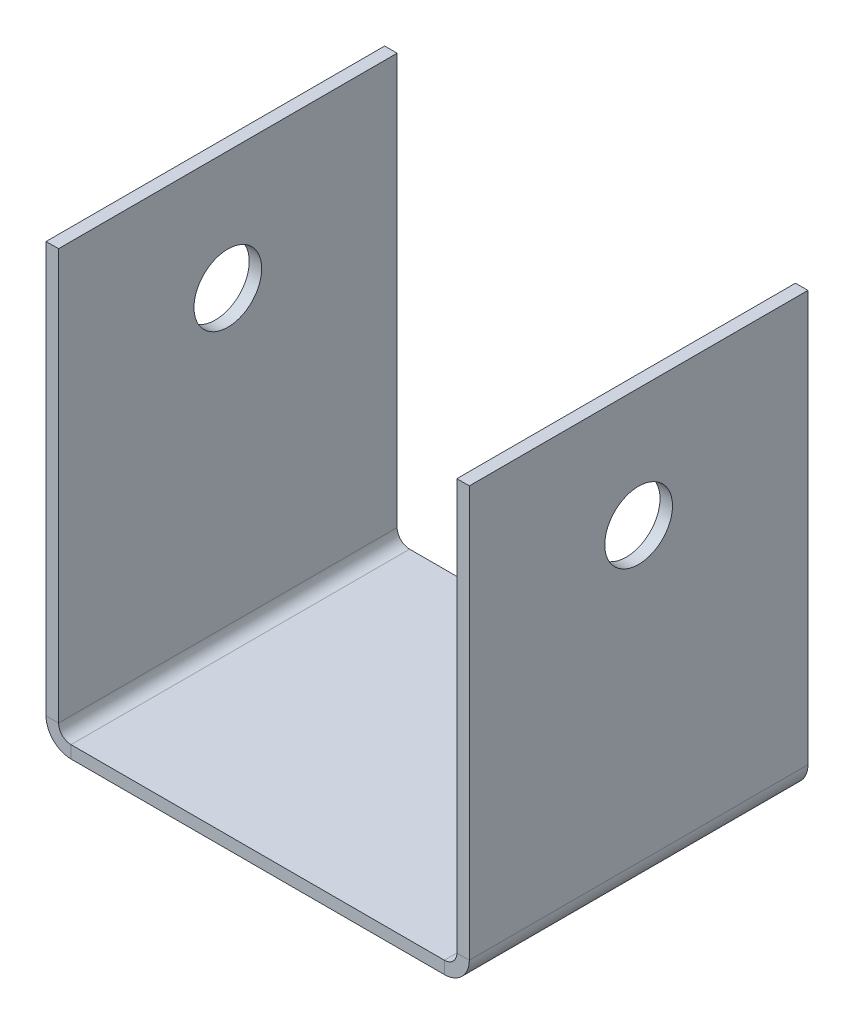
ISO-10303-21;
HEADER;
FILE_DESCRIPTION(('STEP AP214'),'2;1');
FILE_NAME('part.step','',(''),(''),'','','');
FILE_SCHEMA(('AUTOMOTIVE_DESIGN { 1 0 10303 214 1 1 1 1 }'));
ENDSEC;
DATA;
#1=APPLICATION_CONTEXT('core data for automotive mechanical design processes');
#2=APPLICATION_PROTOCOL_DEFINITION('international standard','automotive_design',2000,#1);
#3=PRODUCT_CONTEXT('',#1,'mechanical');
#4=PRODUCT('Part','Part','',(#3));
#5=PRODUCT_RELATED_PRODUCT_CATEGORY('part','',(#4));
#6=PRODUCT_DEFINITION_FORMATION('','',#4);
#7=PRODUCT_DEFINITION_CONTEXT('part definition',#1,'design');
#8=PRODUCT_DEFINITION('design','',#6,#7);
#9=PRODUCT_DEFINITION_SHAPE('','',#8);
#10=(LENGTH_UNIT() NAMED_UNIT(*) SI_UNIT(.MILLI.,.METRE.));
#11=(NAMED_UNIT(*) PLANE_ANGLE_UNIT() SI_UNIT($,.RADIAN.));
#12=(NAMED_UNIT(*) SI_UNIT($,.STERADIAN.) SOLID_ANGLE_UNIT());
#13=UNCERTAINTY_MEASURE_WITH_UNIT(LENGTH_MEASURE(1.E-05),#10,'distance_accuracy_value','');
#14=(GEOMETRIC_REPRESENTATION_CONTEXT(3) GLOBAL_UNCERTAINTY_ASSIGNED_CONTEXT((#13)) GLOBAL_UNIT_ASSIGNED_CONTEXT((#10,
#11,#12)) REPRESENTATION_CONTEXT('',''));
#15=CARTESIAN_POINT('',(0.,0.,0.));
#16=DIRECTION('',(0.,0.,1.));
#17=DIRECTION('',(1.,0.,0.));
#18=AXIS2_PLACEMENT_3D('',#15,#16,#17);
#19=CARTESIAN_POINT('',(0.,-0.7366,0.));
#20=DIRECTION('',(0.,-1.,0.));
#21=DIRECTION('',(0.,0.,-1.));
#22=AXIS2_PLACEMENT_3D('',#19,#20,#21);
#23=PLANE('',#22);
#24=DIRECTION('',(1.,0.,0.));
#25=VECTOR('',#24,1.);
#26=CARTESIAN_POINT('',(-12.5,-0.7366,10.));
#27=LINE('',#26,#25);
#28=CARTESIAN_POINT('',(-11.0268,-0.736600000000001,10.));
#29=VERTEX_POINT('',#28);
#30=CARTESIAN_POINT('',(11.0268,-0.7366,10.));
#31=VERTEX_POINT('',#30);
#32=EDGE_CURVE('E13',#29,#31,#27,.T.);
#33=ORIENTED_EDGE('',*,*,#32,.F.);
#34=DIRECTION('',(0.,0.,1.));
#35=VECTOR('',#34,1.);
#36=CARTESIAN_POINT('',(-11.0268,-0.736600000000001,10.));
#37=LINE('',#36,#35);
#38=CARTESIAN_POINT('',(-11.0268,-0.7366,-10.));
#39=VERTEX_POINT('',#38);
#40=EDGE_CURVE('E208',#29,#39,#37,.F.);
#41=ORIENTED_EDGE('',*,*,#40,.T.);
#42=DIRECTION('',(-1.,0.,0.));
#43=VECTOR('',#42,1.);
#44=CARTESIAN_POINT('',(-12.5,-0.7366,-10.));
#45=LINE('',#44,#43);
#46=CARTESIAN_POINT('',(11.0268,-0.736600000000001,-10.));
#47=VERTEX_POINT('',#46);
#48=EDGE_CURVE('E84',#47,#39,#45,.T.);
#49=ORIENTED_EDGE('',*,*,#48,.F.);
#50=DIRECTION('',(0.,0.,-1.));
#51=VECTOR('',#50,1.);
#52=CARTESIAN_POINT('',(11.0268,-0.736600000000001,-10.));
#53=LINE('',#52,#51);
#54=EDGE_CURVE('E259',#47,#31,#53,.F.);
#55=ORIENTED_EDGE('',*,*,#54,.T.);
#56=EDGE_LOOP('',(#33,#41,#49,#55));
#57=FACE_BOUND('',#56,.T.);
#58=ADVANCED_FACE('F75',(#57),#23,.T.);
#59=CARTESIAN_POINT('',(0.,0.,0.));
#60=DIRECTION('',(0.,-1.,0.));
#61=DIRECTION('',(0.,0.,-1.));
#62=AXIS2_PLACEMENT_3D('',#59,#60,#61);
#63=PLANE('',#62);
#64=DIRECTION('',(0.,0.,1.));
#65=VECTOR('',#64,1.);
#66=CARTESIAN_POINT('',(-11.0268,0.,10.));
#67=LINE('',#66,#65);
#68=CARTESIAN_POINT('',(-11.0268,0.,10.));
#69=VERTEX_POINT('',#68);
#70=CARTESIAN_POINT('',(-11.0268,0.,-10.));
#71=VERTEX_POINT('',#70);
#72=EDGE_CURVE('E219',#69,#71,#67,.F.);
#73=ORIENTED_EDGE('',*,*,#72,.F.);
#74=DIRECTION('',(1.,0.,0.));
#75=VECTOR('',#74,1.);
#76=CARTESIAN_POINT('',(-12.5,0.,10.));
#77=LINE('',#76,#75);
#78=CARTESIAN_POINT('',(11.0268,0.,10.));
#79=VERTEX_POINT('',#78);
#80=EDGE_CURVE('E79',#69,#79,#77,.T.);
#81=ORIENTED_EDGE('',*,*,#80,.T.);
#82=DIRECTION('',(0.,0.,-1.));
#83=VECTOR('',#82,1.);
#84=CARTESIAN_POINT('',(11.0268,0.,-10.));
#85=LINE('',#84,#83);
#86=CARTESIAN_POINT('',(11.0268,0.,-10.));
#87=VERTEX_POINT('',#86);
#88=EDGE_CURVE('E270',#87,#79,#85,.F.);
#89=ORIENTED_EDGE('',*,*,#88,.F.);
#90=DIRECTION('',(-1.,0.,0.));
#91=VECTOR('',#90,1.);
#92=CARTESIAN_POINT('',(-12.5,0.,-10.));
#93=LINE('',#92,#91);
#94=EDGE_CURVE('E276',#87,#71,#93,.T.);
#95=ORIENTED_EDGE('',*,*,#94,.T.);
#96=EDGE_LOOP('',(#73,#81,#89,#95));
#97=FACE_BOUND('',#96,.T.);
#98=ADVANCED_FACE('F288',(#97),#63,.F.);
#99=CARTESIAN_POINT('',(-12.5,-0.7366,10.));
#100=DIRECTION('',(0.,0.,1.));
#101=DIRECTION('',(1.,0.,0.));
#102=AXIS2_PLACEMENT_3D('',#99,#100,#101);
#103=PLANE('',#102);
#104=ORIENTED_EDGE('',*,*,#80,.F.);
#105=DIRECTION('',(0.,-1.,0.));
#106=VECTOR('',#105,1.);
#107=CARTESIAN_POINT('',(-11.0268,0.,10.));
#108=LINE('',#107,#106);
#109=EDGE_CURVE('E213',#69,#29,#108,.T.);
#110=ORIENTED_EDGE('',*,*,#109,.T.);
#111=ORIENTED_EDGE('',*,*,#32,.T.);
#112=DIRECTION('',(0.,-1.,0.));
#113=VECTOR('',#112,1.);
#114=CARTESIAN_POINT('',(11.0268,0.,10.));
#115=LINE('',#114,#113);
#116=EDGE_CURVE('E274',#79,#31,#115,.T.);
#117=ORIENTED_EDGE('',*,*,#116,.F.);
#118=EDGE_LOOP('',(#104,#110,#111,#117));
#119=FACE_BOUND('',#118,.T.);
#120=ADVANCED_FACE('F290',(#119),#103,.T.);
#121=CARTESIAN_POINT('',(-12.5,-0.7366,-10.));
#122=DIRECTION('',(0.,0.,-1.));
#123=DIRECTION('',(-1.,0.,0.));
#124=AXIS2_PLACEMENT_3D('',#121,#122,#123);
#125=PLANE('',#124);
#126=DIRECTION('',(0.,-1.,0.));
#127=VECTOR('',#126,1.);
#128=CARTESIAN_POINT('',(-11.0268,0.,-10.));
#129=LINE('',#128,#127);
#130=EDGE_CURVE('E224',#71,#39,#129,.T.);
#131=ORIENTED_EDGE('',*,*,#130,.F.);
#132=ORIENTED_EDGE('',*,*,#94,.F.);
#133=DIRECTION('',(0.,-1.,0.));
#134=VECTOR('',#133,1.);
#135=CARTESIAN_POINT('',(11.0268,0.,-10.));
#136=LINE('',#135,#134);
#137=EDGE_CURVE('E264',#87,#47,#136,.T.);
#138=ORIENTED_EDGE('',*,*,#137,.T.);
#139=ORIENTED_EDGE('',*,*,#48,.T.);
#140=EDGE_LOOP('',(#131,#132,#138,#139));
#141=FACE_BOUND('',#140,.T.);
#142=ADVANCED_FACE('F77',(#141),#125,.T.);
#143=CARTESIAN_POINT('',(11.0268,0.7366,10.));
#144=DIRECTION('',(0.,0.,1.));
#145=DIRECTION('',(1.,0.,0.));
#146=AXIS2_PLACEMENT_3D('',#143,#144,#145);
#147=PLANE('',#146);
#148=DIRECTION('',(-1.,0.,0.));
#149=VECTOR('',#148,1.);
#150=CARTESIAN_POINT('',(12.5,0.736599999999994,10.));
#151=LINE('',#150,#149);
#152=CARTESIAN_POINT('',(11.7634,0.736599999999997,10.));
#153=VERTEX_POINT('',#152);
#154=CARTESIAN_POINT('',(12.5,0.736599999999994,10.));
#155=VERTEX_POINT('',#154);
#156=EDGE_CURVE('E226',#153,#155,#151,.F.);
#157=ORIENTED_EDGE('',*,*,#156,.F.);
#158=CARTESIAN_POINT('',(11.0268,0.7366,10.));
#159=DIRECTION('',(0.,0.,-1.));
#160=DIRECTION('',(-1.,0.,0.));
#161=AXIS2_PLACEMENT_3D('',#158,#159,#160);
#162=CIRCLE('',#161,0.7366);
#163=EDGE_CURVE('E267',#79,#153,#162,.F.);
#164=ORIENTED_EDGE('',*,*,#163,.F.);
#165=ORIENTED_EDGE('',*,*,#116,.T.);
#166=CARTESIAN_POINT('',(11.0268,0.7366,10.));
#167=DIRECTION('',(0.,0.,-1.));
#168=DIRECTION('',(-1.,0.,0.));
#169=AXIS2_PLACEMENT_3D('',#166,#167,#168);
#170=CIRCLE('',#169,1.4732);
#171=EDGE_CURVE('E92',#31,#155,#170,.F.);
#172=ORIENTED_EDGE('',*,*,#171,.T.);
#173=EDGE_LOOP('',(#157,#164,#165,#172));
#174=FACE_BOUND('',#173,.T.);
#175=ADVANCED_FACE('F294',(#174),#147,.T.);
#176=CARTESIAN_POINT('',(11.0268,0.7366,-10.));
#177=DIRECTION('',(0.,0.,1.));
#178=DIRECTION('',(1.,0.,0.));
#179=AXIS2_PLACEMENT_3D('',#176,#177,#178);
#180=PLANE('',#179);
#181=CARTESIAN_POINT('',(11.0268,0.7366,-10.));
#182=DIRECTION('',(0.,0.,-1.));
#183=DIRECTION('',(-1.,0.,0.));
#184=AXIS2_PLACEMENT_3D('',#181,#182,#183);
#185=CIRCLE('',#184,0.7366);
#186=CARTESIAN_POINT('',(11.7634,0.736599999999997,-10.));
#187=VERTEX_POINT('',#186);
#188=EDGE_CURVE('E232',#187,#87,#185,.T.);
#189=ORIENTED_EDGE('',*,*,#188,.F.);
#190=DIRECTION('',(-1.,0.,0.));
#191=VECTOR('',#190,1.);
#192=CARTESIAN_POINT('',(11.7634,0.736599999999997,-10.));
#193=LINE('',#192,#191);
#194=CARTESIAN_POINT('',(12.5,0.736599999999994,-10.));
#195=VERTEX_POINT('',#194);
#196=EDGE_CURVE('E252',#187,#195,#193,.F.);
#197=ORIENTED_EDGE('',*,*,#196,.T.);
#198=CARTESIAN_POINT('',(11.0268,0.7366,-10.));
#199=DIRECTION('',(0.,0.,-1.));
#200=DIRECTION('',(-1.,0.,0.));
#201=AXIS2_PLACEMENT_3D('',#198,#199,#200);
#202=CIRCLE('',#201,1.4732);
#203=EDGE_CURVE('E262',#195,#47,#202,.T.);
#204=ORIENTED_EDGE('',*,*,#203,.T.);
#205=ORIENTED_EDGE('',*,*,#137,.F.);
#206=EDGE_LOOP('',(#189,#197,#204,#205));
#207=FACE_BOUND('',#206,.T.);
#208=ADVANCED_FACE('F318',(#207),#180,.F.);
#209=CARTESIAN_POINT('',(11.0268,0.7366,-10.));
#210=DIRECTION('',(0.,0.,-1.));
#211=DIRECTION('',(1.,0.,0.));
#212=AXIS2_PLACEMENT_3D('',#209,#210,#211);
#213=CYLINDRICAL_SURFACE('',#212,1.4732);
#214=ORIENTED_EDGE('',*,*,#54,.F.);
#215=ORIENTED_EDGE('',*,*,#203,.F.);
#216=DIRECTION('',(0.,0.,-1.));
#217=VECTOR('',#216,1.);
#218=CARTESIAN_POINT('',(12.5,0.736599999999994,10.));
#219=LINE('',#218,#217);
#220=EDGE_CURVE('E250',#195,#155,#219,.F.);
#221=ORIENTED_EDGE('',*,*,#220,.T.);
#222=ORIENTED_EDGE('',*,*,#171,.F.);
#223=EDGE_LOOP('',(#214,#215,#221,#222));
#224=FACE_BOUND('',#223,.T.);
#225=ADVANCED_FACE('F321',(#224),#213,.T.);
#226=CARTESIAN_POINT('',(11.0268,0.7366,-10.));
#227=DIRECTION('',(0.,0.,-1.));
#228=DIRECTION('',(1.,0.,0.));
#229=AXIS2_PLACEMENT_3D('',#226,#227,#228);
#230=CYLINDRICAL_SURFACE('',#229,0.7366);
#231=ORIENTED_EDGE('',*,*,#88,.T.);
#232=ORIENTED_EDGE('',*,*,#163,.T.);
#233=DIRECTION('',(0.,0.,-1.));
#234=VECTOR('',#233,1.);
#235=CARTESIAN_POINT('',(11.7634,0.736599999999997,10.));
#236=LINE('',#235,#234);
#237=EDGE_CURVE('E255',#153,#187,#236,.T.);
#238=ORIENTED_EDGE('',*,*,#237,.T.);
#239=ORIENTED_EDGE('',*,*,#188,.T.);
#240=EDGE_LOOP('',(#231,#232,#238,#239));
#241=FACE_BOUND('',#240,.T.);
#242=ADVANCED_FACE('F297',(#241),#230,.F.);
#243=CARTESIAN_POINT('',(12.5,0.,10.));
#244=DIRECTION('',(0.,0.,-1.));
#245=DIRECTION('',(0.,1.,0.));
#246=AXIS2_PLACEMENT_3D('',#243,#244,#245);
#247=PLANE('',#246);
#248=ORIENTED_EDGE('',*,*,#156,.T.);
#249=DIRECTION('',(0.,-1.,0.));
#250=VECTOR('',#249,1.);
#251=CARTESIAN_POINT('',(12.5,0.,10.));
#252=LINE('',#251,#250);
#253=CARTESIAN_POINT('',(12.5000000000001,25.,10.));
#254=VERTEX_POINT('',#253);
#255=EDGE_CURVE('E240',#254,#155,#252,.T.);
#256=ORIENTED_EDGE('',*,*,#255,.F.);
#257=DIRECTION('',(-1.,0.,0.));
#258=VECTOR('',#257,1.);
#259=CARTESIAN_POINT('',(12.5000000000001,25.,10.));
#260=LINE('',#259,#258);
#261=CARTESIAN_POINT('',(11.7634000000001,25.,10.));
#262=VERTEX_POINT('',#261);
#263=EDGE_CURVE('E233',#254,#262,#260,.T.);
#264=ORIENTED_EDGE('',*,*,#263,.T.);
#265=DIRECTION('',(0.,1.,0.));
#266=VECTOR('',#265,1.);
#267=CARTESIAN_POINT('',(11.7634,0.,10.));
#268=LINE('',#267,#266);
#269=EDGE_CURVE('E247',#262,#153,#268,.F.);
#270=ORIENTED_EDGE('',*,*,#269,.T.);
#271=EDGE_LOOP('',(#248,#256,#264,#270));
#272=FACE_BOUND('',#271,.T.);
#273=ADVANCED_FACE('F305',(#272),#247,.F.);
#274=CARTESIAN_POINT('',(12.5000000000001,25.,-9.99999999999999));
#275=DIRECTION('',(0.,0.,1.));
#276=DIRECTION('',(0.,-1.,0.));
#277=AXIS2_PLACEMENT_3D('',#274,#275,#276);
#278=PLANE('',#277);
#279=ORIENTED_EDGE('',*,*,#196,.F.);
#280=DIRECTION('',(0.,-1.,0.));
#281=VECTOR('',#280,1.);
#282=CARTESIAN_POINT('',(11.7634000000001,25.,-9.99999999999999));
#283=LINE('',#282,#281);
#284=CARTESIAN_POINT('',(11.7634000000001,25.,-9.99999999999999));
#285=VERTEX_POINT('',#284);
#286=EDGE_CURVE('E245',#187,#285,#283,.F.);
#287=ORIENTED_EDGE('',*,*,#286,.T.);
#288=DIRECTION('',(-1.,0.,0.));
#289=VECTOR('',#288,1.);
#290=CARTESIAN_POINT('',(12.5000000000001,25.,-9.99999999999999));
#291=LINE('',#290,#289);
#292=CARTESIAN_POINT('',(12.5000000000001,25.,-9.99999999999999));
#293=VERTEX_POINT('',#292);
#294=EDGE_CURVE('E229',#293,#285,#291,.T.);
#295=ORIENTED_EDGE('',*,*,#294,.F.);
#296=DIRECTION('',(0.,1.,0.));
#297=VECTOR('',#296,1.);
#298=CARTESIAN_POINT('',(12.5,0.,-10.));
#299=LINE('',#298,#297);
#300=EDGE_CURVE('E238',#195,#293,#299,.T.);
#301=ORIENTED_EDGE('',*,*,#300,.F.);
#302=EDGE_LOOP('',(#279,#287,#295,#301));
#303=FACE_BOUND('',#302,.T.);
#304=ADVANCED_FACE('F315',(#303),#278,.F.);
#305=CARTESIAN_POINT('',(12.5,0.,0.));
#306=DIRECTION('',(-1.,0.,0.));
#307=DIRECTION('',(0.,-1.,0.));
#308=AXIS2_PLACEMENT_3D('',#305,#306,#307);
#309=PLANE('',#308);
#310=CARTESIAN_POINT('',(12.5000000000001,17.9834,0.));
#311=DIRECTION('',(1.,0.,0.));
#312=DIRECTION('',(0.,0.,-1.));
#313=AXIS2_PLACEMENT_3D('',#310,#311,#312);
#314=CIRCLE('',#313,1.99999999999999);
#315=CARTESIAN_POINT('',(12.5000000000001,17.9834,-1.99999999999999));
#316=VERTEX_POINT('',#315);
#317=EDGE_CURVE('E349',#316,#316,#314,.T.);
#318=ORIENTED_EDGE('',*,*,#317,.F.);
#319=EDGE_LOOP('',(#318));
#320=FACE_BOUND('',#319,.T.);
#321=ORIENTED_EDGE('',*,*,#220,.F.);
#322=ORIENTED_EDGE('',*,*,#300,.T.);
#323=DIRECTION('',(0.,0.,1.));
#324=VECTOR('',#323,1.);
#325=CARTESIAN_POINT('',(12.5000000000001,25.,0.));
#326=LINE('',#325,#324);
#327=EDGE_CURVE('E236',#293,#254,#326,.T.);
#328=ORIENTED_EDGE('',*,*,#327,.T.);
#329=ORIENTED_EDGE('',*,*,#255,.T.);
#330=EDGE_LOOP('',(#321,#322,#328,#329));
#331=FACE_BOUND('',#330,.T.);
#332=ADVANCED_FACE('F320',(#320,#331),#309,.F.);
#333=CARTESIAN_POINT('',(11.7634,0.,0.));
#334=DIRECTION('',(-1.,0.,0.));
#335=DIRECTION('',(0.,-1.,0.));
#336=AXIS2_PLACEMENT_3D('',#333,#334,#335);
#337=PLANE('',#336);
#338=CARTESIAN_POINT('',(11.7634000000001,17.9834,0.));
#339=DIRECTION('',(-1.,0.,0.));
#340=DIRECTION('',(0.,-1.,0.));
#341=AXIS2_PLACEMENT_3D('',#338,#339,#340);
#342=CIRCLE('',#341,1.99999999999999);
#343=CARTESIAN_POINT('',(11.7634000000001,15.9834,0.));
#344=VERTEX_POINT('',#343);
#345=EDGE_CURVE('E207',#344,#344,#342,.T.);
#346=ORIENTED_EDGE('',*,*,#345,.F.);
#347=EDGE_LOOP('',(#346));
#348=FACE_BOUND('',#347,.T.);
#349=ORIENTED_EDGE('',*,*,#286,.F.);
#350=ORIENTED_EDGE('',*,*,#237,.F.);
#351=ORIENTED_EDGE('',*,*,#269,.F.);
#352=DIRECTION('',(0.,0.,-1.));
#353=VECTOR('',#352,1.);
#354=CARTESIAN_POINT('',(11.7634000000001,25.,10.));
#355=LINE('',#354,#353);
#356=EDGE_CURVE('E243',#285,#262,#355,.F.);
#357=ORIENTED_EDGE('',*,*,#356,.F.);
#358=EDGE_LOOP('',(#349,#350,#351,#357));
#359=FACE_BOUND('',#358,.T.);
#360=ADVANCED_FACE('F302',(#348,#359),#337,.T.);
#361=CARTESIAN_POINT('',(12.5000000000001,25.,10.));
#362=DIRECTION('',(0.,-1.,0.));
#363=DIRECTION('',(1.,0.,0.));
#364=AXIS2_PLACEMENT_3D('',#361,#362,#363);
#365=PLANE('',#364);
#366=ORIENTED_EDGE('',*,*,#356,.T.);
#367=ORIENTED_EDGE('',*,*,#263,.F.);
#368=ORIENTED_EDGE('',*,*,#327,.F.);
#369=ORIENTED_EDGE('',*,*,#294,.T.);
#370=EDGE_LOOP('',(#366,#367,#368,#369));
#371=FACE_BOUND('',#370,.T.);
#372=ADVANCED_FACE('F310',(#371),#365,.F.);
#373=CARTESIAN_POINT('',(-11.0268,0.7366,-10.));
#374=DIRECTION('',(0.,0.,-1.));
#375=DIRECTION('',(-1.,0.,0.));
#376=AXIS2_PLACEMENT_3D('',#373,#374,#375);
#377=PLANE('',#376);
#378=DIRECTION('',(1.,0.,0.));
#379=VECTOR('',#378,1.);
#380=CARTESIAN_POINT('',(-12.5,0.736599999999994,-10.));
#381=LINE('',#380,#379);
#382=CARTESIAN_POINT('',(-11.7634,0.736599999999997,-10.));
#383=VERTEX_POINT('',#382);
#384=CARTESIAN_POINT('',(-12.5,0.736599999999994,-10.));
#385=VERTEX_POINT('',#384);
#386=EDGE_CURVE('E190',#383,#385,#381,.F.);
#387=ORIENTED_EDGE('',*,*,#386,.F.);
#388=CARTESIAN_POINT('',(-11.0268,0.7366,-10.));
#389=DIRECTION('',(0.,0.,1.));
#390=DIRECTION('',(1.,0.,0.));
#391=AXIS2_PLACEMENT_3D('',#388,#389,#390);
#392=CIRCLE('',#391,0.7366);
#393=EDGE_CURVE('E216',#71,#383,#392,.F.);
#394=ORIENTED_EDGE('',*,*,#393,.F.);
#395=ORIENTED_EDGE('',*,*,#130,.T.);
#396=CARTESIAN_POINT('',(-11.0268,0.7366,-10.));
#397=DIRECTION('',(0.,0.,1.));
#398=DIRECTION('',(1.,0.,0.));
#399=AXIS2_PLACEMENT_3D('',#396,#397,#398);
#400=CIRCLE('',#399,1.4732);
#401=EDGE_CURVE('E100',#39,#385,#400,.F.);
#402=ORIENTED_EDGE('',*,*,#401,.T.);
#403=EDGE_LOOP('',(#387,#394,#395,#402));
#404=FACE_BOUND('',#403,.T.);
#405=ADVANCED_FACE('F328',(#404),#377,.T.);
#406=CARTESIAN_POINT('',(-11.0268,0.7366,10.));
#407=DIRECTION('',(0.,0.,-1.));
#408=DIRECTION('',(-1.,0.,0.));
#409=AXIS2_PLACEMENT_3D('',#406,#407,#408);
#410=PLANE('',#409);
#411=CARTESIAN_POINT('',(-11.0268,0.7366,10.));
#412=DIRECTION('',(0.,0.,1.));
#413=DIRECTION('',(1.,0.,0.));
#414=AXIS2_PLACEMENT_3D('',#411,#412,#413);
#415=CIRCLE('',#414,0.7366);
#416=CARTESIAN_POINT('',(-11.7634,0.736599999999997,10.));
#417=VERTEX_POINT('',#416);
#418=EDGE_CURVE('E221',#417,#69,#415,.T.);
#419=ORIENTED_EDGE('',*,*,#418,.F.);
#420=DIRECTION('',(1.,0.,0.));
#421=VECTOR('',#420,1.);
#422=CARTESIAN_POINT('',(-11.7634,0.736599999999997,10.));
#423=LINE('',#422,#421);
#424=CARTESIAN_POINT('',(-12.5,0.736599999999994,10.));
#425=VERTEX_POINT('',#424);
#426=EDGE_CURVE('E201',#417,#425,#423,.F.);
#427=ORIENTED_EDGE('',*,*,#426,.T.);
#428=CARTESIAN_POINT('',(-11.0268,0.7366,10.));
#429=DIRECTION('',(0.,0.,1.));
#430=DIRECTION('',(1.,0.,0.));
#431=AXIS2_PLACEMENT_3D('',#428,#429,#430);
#432=CIRCLE('',#431,1.4732);
#433=EDGE_CURVE('E211',#425,#29,#432,.T.);
#434=ORIENTED_EDGE('',*,*,#433,.T.);
#435=ORIENTED_EDGE('',*,*,#109,.F.);
#436=EDGE_LOOP('',(#419,#427,#434,#435));
#437=FACE_BOUND('',#436,.T.);
#438=ADVANCED_FACE('F394',(#437),#410,.F.);
#439=CARTESIAN_POINT('',(-11.0268,0.7366,10.));
#440=DIRECTION('',(0.,0.,1.));
#441=DIRECTION('',(-1.,0.,0.));
#442=AXIS2_PLACEMENT_3D('',#439,#440,#441);
#443=CYLINDRICAL_SURFACE('',#442,1.4732);
#444=ORIENTED_EDGE('',*,*,#40,.F.);
#445=ORIENTED_EDGE('',*,*,#433,.F.);
#446=DIRECTION('',(0.,0.,1.));
#447=VECTOR('',#446,1.);
#448=CARTESIAN_POINT('',(-12.5,0.736599999999994,-10.));
#449=LINE('',#448,#447);
#450=EDGE_CURVE('E199',#425,#385,#449,.F.);
#451=ORIENTED_EDGE('',*,*,#450,.T.);
#452=ORIENTED_EDGE('',*,*,#401,.F.);
#453=EDGE_LOOP('',(#444,#445,#451,#452));
#454=FACE_BOUND('',#453,.T.);
#455=ADVANCED_FACE('F399',(#454),#443,.T.);
#456=CARTESIAN_POINT('',(-11.0268,0.7366,10.));
#457=DIRECTION('',(0.,0.,1.));
#458=DIRECTION('',(-1.,0.,0.));
#459=AXIS2_PLACEMENT_3D('',#456,#457,#458);
#460=CYLINDRICAL_SURFACE('',#459,0.7366);
#461=ORIENTED_EDGE('',*,*,#72,.T.);
#462=ORIENTED_EDGE('',*,*,#393,.T.);
#463=DIRECTION('',(0.,0.,1.));
#464=VECTOR('',#463,1.);
#465=CARTESIAN_POINT('',(-11.7634,0.736599999999997,-10.));
#466=LINE('',#465,#464);
#467=EDGE_CURVE('E204',#383,#417,#466,.T.);
#468=ORIENTED_EDGE('',*,*,#467,.T.);
#469=ORIENTED_EDGE('',*,*,#418,.T.);
#470=EDGE_LOOP('',(#461,#462,#468,#469));
#471=FACE_BOUND('',#470,.T.);
#472=ADVANCED_FACE('F331',(#471),#460,.F.);
#473=CARTESIAN_POINT('',(-12.5,0.,-10.));
#474=DIRECTION('',(0.,0.,1.));
#475=DIRECTION('',(0.,-1.,0.));
#476=AXIS2_PLACEMENT_3D('',#473,#474,#475);
#477=PLANE('',#476);
#478=ORIENTED_EDGE('',*,*,#386,.T.);
#479=DIRECTION('',(0.,-1.,0.));
#480=VECTOR('',#479,1.);
#481=CARTESIAN_POINT('',(-12.5,0.,-10.));
#482=LINE('',#481,#480);
#483=CARTESIAN_POINT('',(-12.5000000000001,25.,-10.));
#484=VERTEX_POINT('',#483);
#485=EDGE_CURVE('E171',#484,#385,#482,.T.);
#486=ORIENTED_EDGE('',*,*,#485,.F.);
#487=DIRECTION('',(1.,0.,0.));
#488=VECTOR('',#487,1.);
#489=CARTESIAN_POINT('',(-12.5000000000001,25.,-10.));
#490=LINE('',#489,#488);
#491=CARTESIAN_POINT('',(-11.7634000000001,25.,-10.));
#492=VERTEX_POINT('',#491);
#493=EDGE_CURVE('E177',#484,#492,#490,.T.);
#494=ORIENTED_EDGE('',*,*,#493,.T.);
#495=DIRECTION('',(0.,1.,0.));
#496=VECTOR('',#495,1.);
#497=CARTESIAN_POINT('',(-11.7634,0.,-10.));
#498=LINE('',#497,#496);
#499=EDGE_CURVE('E197',#492,#383,#498,.F.);
#500=ORIENTED_EDGE('',*,*,#499,.T.);
#501=EDGE_LOOP('',(#478,#486,#494,#500));
#502=FACE_BOUND('',#501,.T.);
#503=ADVANCED_FACE('F189',(#502),#477,.F.);
#504=CARTESIAN_POINT('',(-12.5000000000001,25.,9.99999999999999));
#505=DIRECTION('',(0.,0.,-1.));
#506=DIRECTION('',(0.,1.,0.));
#507=AXIS2_PLACEMENT_3D('',#504,#505,#506);
#508=PLANE('',#507);
#509=ORIENTED_EDGE('',*,*,#426,.F.);
#510=DIRECTION('',(0.,-1.,0.));
#511=VECTOR('',#510,1.);
#512=CARTESIAN_POINT('',(-11.7634000000001,25.,9.99999999999999));
#513=LINE('',#512,#511);
#514=CARTESIAN_POINT('',(-11.7634000000001,25.,9.99999999999999));
#515=VERTEX_POINT('',#514);
#516=EDGE_CURVE('E193',#417,#515,#513,.F.);
#517=ORIENTED_EDGE('',*,*,#516,.T.);
#518=DIRECTION('',(1.,0.,0.));
#519=VECTOR('',#518,1.);
#520=CARTESIAN_POINT('',(-12.5000000000001,25.,9.99999999999999));
#521=LINE('',#520,#519);
#522=CARTESIAN_POINT('',(-12.5000000000001,25.,9.99999999999999));
#523=VERTEX_POINT('',#522);
#524=EDGE_CURVE('E186',#523,#515,#521,.T.);
#525=ORIENTED_EDGE('',*,*,#524,.F.);
#526=DIRECTION('',(0.,1.,0.));
#527=VECTOR('',#526,1.);
#528=CARTESIAN_POINT('',(-12.5,0.,10.));
#529=LINE('',#528,#527);
#530=EDGE_CURVE('E173',#425,#523,#529,.T.);
#531=ORIENTED_EDGE('',*,*,#530,.F.);
#532=EDGE_LOOP('',(#509,#517,#525,#531));
#533=FACE_BOUND('',#532,.T.);
#534=ADVANCED_FACE('F338',(#533),#508,.F.);
#535=CARTESIAN_POINT('',(-12.5,0.,0.));
#536=DIRECTION('',(1.,0.,0.));
#537=DIRECTION('',(0.,1.,0.));
#538=AXIS2_PLACEMENT_3D('',#535,#536,#537);
#539=PLANE('',#538);
#540=CARTESIAN_POINT('',(-12.5000000000001,17.9834,0.));
#541=DIRECTION('',(1.,0.,0.));
#542=DIRECTION('',(0.,0.,-1.));
#543=AXIS2_PLACEMENT_3D('',#540,#541,#542);
#544=CIRCLE('',#543,1.99999999999999);
#545=CARTESIAN_POINT('',(-12.5000000000001,17.9834,-1.99999999999999));
#546=VERTEX_POINT('',#545);
#547=EDGE_CURVE('E346',#546,#546,#544,.T.);
#548=ORIENTED_EDGE('',*,*,#547,.T.);
#549=EDGE_LOOP('',(#548));
#550=FACE_BOUND('',#549,.T.);
#551=ORIENTED_EDGE('',*,*,#450,.F.);
#552=ORIENTED_EDGE('',*,*,#530,.T.);
#553=DIRECTION('',(0.,0.,-1.));
#554=VECTOR('',#553,1.);
#555=CARTESIAN_POINT('',(-12.5000000000001,25.,0.));
#556=LINE('',#555,#554);
#557=EDGE_CURVE('E166',#523,#484,#556,.T.);
#558=ORIENTED_EDGE('',*,*,#557,.T.);
#559=ORIENTED_EDGE('',*,*,#485,.T.);
#560=EDGE_LOOP('',(#551,#552,#558,#559));
#561=FACE_BOUND('',#560,.T.);
#562=ADVANCED_FACE('F169',(#550,#561),#539,.F.);
#563=CARTESIAN_POINT('',(-11.7634,0.,0.));
#564=DIRECTION('',(1.,0.,0.));
#565=DIRECTION('',(0.,1.,0.));
#566=AXIS2_PLACEMENT_3D('',#563,#564,#565);
#567=PLANE('',#566);
#568=CARTESIAN_POINT('',(-11.7634000000001,17.9834,0.));
#569=DIRECTION('',(1.,0.,0.));
#570=DIRECTION('',(0.,1.,0.));
#571=AXIS2_PLACEMENT_3D('',#568,#569,#570);
#572=CIRCLE('',#571,1.99999999999999);
#573=CARTESIAN_POINT('',(-11.7634000000001,19.9834,0.));
#574=VERTEX_POINT('',#573);
#575=EDGE_CURVE('E343',#574,#574,#572,.T.);
#576=ORIENTED_EDGE('',*,*,#575,.F.);
#577=EDGE_LOOP('',(#576));
#578=FACE_BOUND('',#577,.T.);
#579=ORIENTED_EDGE('',*,*,#516,.F.);
#580=ORIENTED_EDGE('',*,*,#467,.F.);
#581=ORIENTED_EDGE('',*,*,#499,.F.);
#582=DIRECTION('',(0.,0.,1.));
#583=VECTOR('',#582,1.);
#584=CARTESIAN_POINT('',(-11.7634000000001,25.,-10.));
#585=LINE('',#584,#583);
#586=EDGE_CURVE('E182',#515,#492,#585,.F.);
#587=ORIENTED_EDGE('',*,*,#586,.F.);
#588=EDGE_LOOP('',(#579,#580,#581,#587));
#589=FACE_BOUND('',#588,.T.);
#590=ADVANCED_FACE('F335',(#578,#589),#567,.T.);
#591=CARTESIAN_POINT('',(-12.5000000000001,25.,-10.));
#592=DIRECTION('',(0.,-1.,0.));
#593=DIRECTION('',(1.,0.,0.));
#594=AXIS2_PLACEMENT_3D('',#591,#592,#593);
#595=PLANE('',#594);
#596=ORIENTED_EDGE('',*,*,#586,.T.);
#597=ORIENTED_EDGE('',*,*,#493,.F.);
#598=ORIENTED_EDGE('',*,*,#557,.F.);
#599=ORIENTED_EDGE('',*,*,#524,.T.);
#600=EDGE_LOOP('',(#596,#597,#598,#599));
#601=FACE_BOUND('',#600,.T.);
#602=ADVANCED_FACE('F180',(#601),#595,.F.);
#603=CARTESIAN_POINT('',(12.5000000000001,17.9834,0.));
#604=DIRECTION('',(1.,0.,0.));
#605=DIRECTION('',(0.,0.,-1.));
#606=AXIS2_PLACEMENT_3D('',#603,#604,#605);
#607=CYLINDRICAL_SURFACE('',#606,1.99999999999999);
#608=ORIENTED_EDGE('',*,*,#575,.T.);
#609=EDGE_LOOP('',(#608));
#610=FACE_BOUND('',#609,.T.);
#611=ORIENTED_EDGE('',*,*,#547,.F.);
#612=EDGE_LOOP('',(#611));
#613=FACE_BOUND('',#612,.T.);
#614=ADVANCED_FACE('F412',(#610,#613),#607,.F.);
#615=ORIENTED_EDGE('',*,*,#345,.T.);
#616=EDGE_LOOP('',(#615));
#617=FACE_BOUND('',#616,.T.);
#618=ORIENTED_EDGE('',*,*,#317,.T.);
#619=EDGE_LOOP('',(#618));
#620=FACE_BOUND('',#619,.T.);
#621=ADVANCED_FACE('F353',(#617,#620),#607,.F.);
#622=CLOSED_SHELL('',(#58,#98,#120,#142,#175,#208,#225,#242,#273,#304,#332,#360,#372,#405,#438,
#455,#472,#503,#534,#562,#590,#602,#614,#621));
#623=MANIFOLD_SOLID_BREP('B2',#622);
#624=ADVANCED_BREP_SHAPE_REPRESENTATION('',(#18,#623),#14);
#625=SHAPE_DEFINITION_REPRESENTATION(#9,#624);
ENDSEC;
END-ISO-10303-21;
